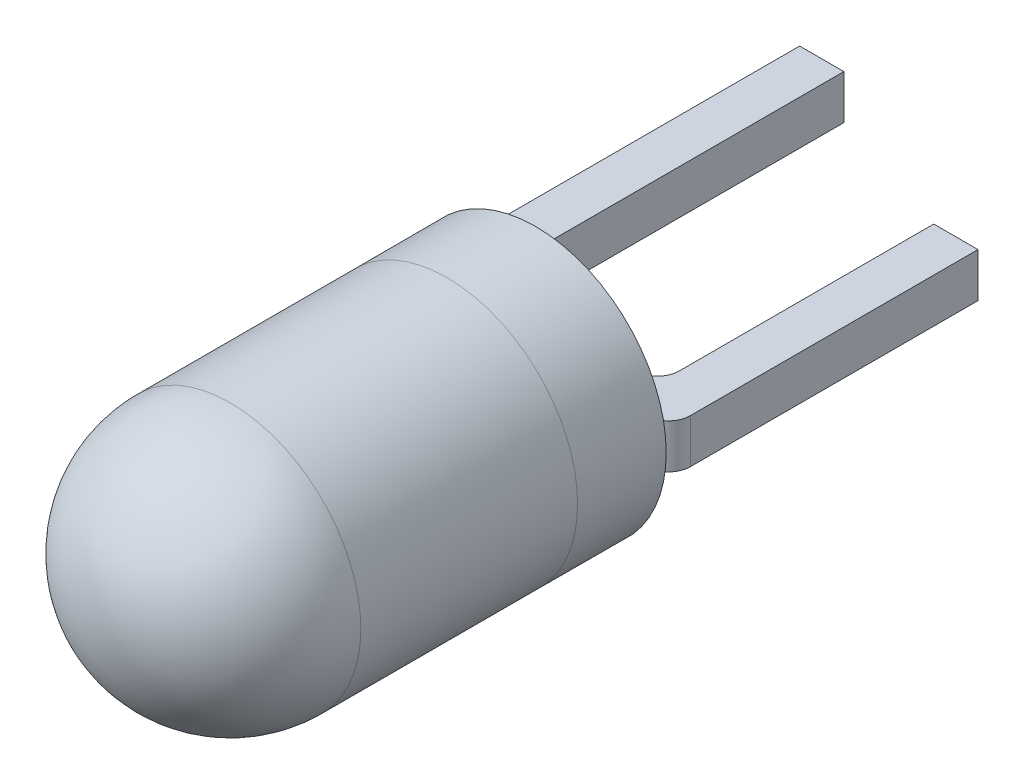
ISO-10303-21;
HEADER;
FILE_DESCRIPTION(('STEP AP214'),'2;1');
FILE_NAME('part.step','',(''),(''),'','','');
FILE_SCHEMA(('AUTOMOTIVE_DESIGN { 1 0 10303 214 1 1 1 1 }'));
ENDSEC;
DATA;
#1=APPLICATION_CONTEXT('core data for automotive mechanical design processes');
#2=APPLICATION_PROTOCOL_DEFINITION('international standard','automotive_design',2000,#1);
#3=PRODUCT_CONTEXT('',#1,'mechanical');
#4=PRODUCT('Part','Part','',(#3));
#5=PRODUCT_RELATED_PRODUCT_CATEGORY('part','',(#4));
#6=PRODUCT_DEFINITION_FORMATION('','',#4);
#7=PRODUCT_DEFINITION_CONTEXT('part definition',#1,'design');
#8=PRODUCT_DEFINITION('design','',#6,#7);
#9=PRODUCT_DEFINITION_SHAPE('','',#8);
#10=(LENGTH_UNIT() NAMED_UNIT(*) SI_UNIT(.MILLI.,.METRE.));
#11=(NAMED_UNIT(*) PLANE_ANGLE_UNIT() SI_UNIT($,.RADIAN.));
#12=(NAMED_UNIT(*) SI_UNIT($,.STERADIAN.) SOLID_ANGLE_UNIT());
#13=UNCERTAINTY_MEASURE_WITH_UNIT(LENGTH_MEASURE(1.E-05),#10,'distance_accuracy_value','');
#14=(GEOMETRIC_REPRESENTATION_CONTEXT(3) GLOBAL_UNCERTAINTY_ASSIGNED_CONTEXT((#13)) GLOBAL_UNIT_ASSIGNED_CONTEXT((#10,
#11,#12)) REPRESENTATION_CONTEXT('',''));
#15=CARTESIAN_POINT('',(0.,0.,0.));
#16=DIRECTION('',(0.,0.,1.));
#17=DIRECTION('',(1.,0.,0.));
#18=AXIS2_PLACEMENT_3D('',#15,#16,#17);
#19=CARTESIAN_POINT('',(-1.26777551269531,0.,-3.175));
#20=DIRECTION('',(0.,0.,-1.));
#21=DIRECTION('',(0.,-1.,0.));
#22=AXIS2_PLACEMENT_3D('',#19,#20,#21);
#23=PLANE('',#22);
#24=DIRECTION('',(0.,-1.,0.));
#25=VECTOR('',#24,1.);
#26=CARTESIAN_POINT('',(-1.01377551269531,0.254,-3.175));
#27=LINE('',#26,#25);
#28=CARTESIAN_POINT('',(-1.01377551269531,0.254,-3.175));
#29=VERTEX_POINT('',#28);
#30=CARTESIAN_POINT('',(-1.01377551269531,-0.254,-3.175));
#31=VERTEX_POINT('',#30);
#32=EDGE_CURVE('E304',#29,#31,#27,.T.);
#33=ORIENTED_EDGE('',*,*,#32,.T.);
#34=DIRECTION('',(-1.,0.,0.));
#35=VECTOR('',#34,1.);
#36=CARTESIAN_POINT('',(-1.01377551269531,-0.254,-3.175));
#37=LINE('',#36,#35);
#38=CARTESIAN_POINT('',(-1.52177551269531,-0.254,-3.175));
#39=VERTEX_POINT('',#38);
#40=EDGE_CURVE('E187',#31,#39,#37,.T.);
#41=ORIENTED_EDGE('',*,*,#40,.T.);
#42=DIRECTION('',(0.,1.,0.));
#43=VECTOR('',#42,1.);
#44=CARTESIAN_POINT('',(-1.52177551269531,0.254,-3.175));
#45=LINE('',#44,#43);
#46=CARTESIAN_POINT('',(-1.52177551269531,0.254,-3.175));
#47=VERTEX_POINT('',#46);
#48=EDGE_CURVE('E283',#39,#47,#45,.T.);
#49=ORIENTED_EDGE('',*,*,#48,.T.);
#50=DIRECTION('',(1.,0.,0.));
#51=VECTOR('',#50,1.);
#52=CARTESIAN_POINT('',(-1.01377551269531,0.254,-3.175));
#53=LINE('',#52,#51);
#54=EDGE_CURVE('E194',#47,#29,#53,.T.);
#55=ORIENTED_EDGE('',*,*,#54,.T.);
#56=EDGE_LOOP('',(#33,#41,#49,#55));
#57=FACE_BOUND('',#56,.T.);
#58=ADVANCED_FACE('F16',(#57),#23,.T.);
#59=CARTESIAN_POINT('',(0.764224487304689,1.53789517878773,1.381));
#60=DIRECTION('',(1.,0.,0.));
#61=DIRECTION('',(0.,-1.,0.));
#62=AXIS2_PLACEMENT_3D('',#59,#60,#61);
#63=PLANE('',#62);
#64=DIRECTION('',(0.,-1.,0.));
#65=VECTOR('',#64,1.);
#66=CARTESIAN_POINT('',(0.764224487304688,-0.254,1.));
#67=LINE('',#66,#65);
#68=CARTESIAN_POINT('',(0.764224487304688,0.254,1.));
#69=VERTEX_POINT('',#68);
#70=CARTESIAN_POINT('',(0.764224487304688,-0.254,1.));
#71=VERTEX_POINT('',#70);
#72=EDGE_CURVE('E160',#69,#71,#67,.T.);
#73=ORIENTED_EDGE('',*,*,#72,.T.);
#74=DIRECTION('',(0.,0.,1.));
#75=VECTOR('',#74,1.);
#76=CARTESIAN_POINT('',(0.764224487304688,-0.254,1.381));
#77=LINE('',#76,#75);
#78=CARTESIAN_POINT('',(0.764224487304688,-0.254,1.381));
#79=VERTEX_POINT('',#78);
#80=EDGE_CURVE('E370',#71,#79,#77,.T.);
#81=ORIENTED_EDGE('',*,*,#80,.T.);
#82=DIRECTION('',(0.,-1.,0.));
#83=VECTOR('',#82,1.);
#84=CARTESIAN_POINT('',(0.764224487304689,1.53789517878773,1.381));
#85=LINE('',#84,#83);
#86=CARTESIAN_POINT('',(0.764224487304688,0.254,1.381));
#87=VERTEX_POINT('',#86);
#88=EDGE_CURVE('E29',#87,#79,#85,.T.);
#89=ORIENTED_EDGE('',*,*,#88,.F.);
#90=DIRECTION('',(0.,0.,1.));
#91=VECTOR('',#90,1.);
#92=CARTESIAN_POINT('',(0.764224487304688,0.254,1.381));
#93=LINE('',#92,#91);
#94=EDGE_CURVE('E271',#69,#87,#93,.T.);
#95=ORIENTED_EDGE('',*,*,#94,.F.);
#96=EDGE_LOOP('',(#73,#81,#89,#95));
#97=FACE_BOUND('',#96,.T.);
#98=ADVANCED_FACE('F474',(#97),#63,.F.);
#99=CARTESIAN_POINT('',(-0.759775512695312,1.53789517878773,1.381));
#100=DIRECTION('',(-1.,0.,0.));
#101=DIRECTION('',(0.,0.,1.));
#102=AXIS2_PLACEMENT_3D('',#99,#100,#101);
#103=PLANE('',#102);
#104=DIRECTION('',(0.,-1.,0.));
#105=VECTOR('',#104,1.);
#106=CARTESIAN_POINT('',(-0.759775512695312,1.53789517878773,1.381));
#107=LINE('',#106,#105);
#108=CARTESIAN_POINT('',(-0.759775512695312,0.254,1.381));
#109=VERTEX_POINT('',#108);
#110=CARTESIAN_POINT('',(-0.759775512695312,-0.254,1.381));
#111=VERTEX_POINT('',#110);
#112=EDGE_CURVE('E158',#109,#111,#107,.T.);
#113=ORIENTED_EDGE('',*,*,#112,.T.);
#114=DIRECTION('',(0.,0.,-1.));
#115=VECTOR('',#114,1.);
#116=CARTESIAN_POINT('',(-0.759775512695312,-0.254,1.381));
#117=LINE('',#116,#115);
#118=CARTESIAN_POINT('',(-0.759775512695313,-0.254,1.));
#119=VERTEX_POINT('',#118);
#120=EDGE_CURVE('E182',#111,#119,#117,.T.);
#121=ORIENTED_EDGE('',*,*,#120,.T.);
#122=DIRECTION('',(0.,1.,0.));
#123=VECTOR('',#122,1.);
#124=CARTESIAN_POINT('',(-0.759775512695312,0.254,1.));
#125=LINE('',#124,#123);
#126=CARTESIAN_POINT('',(-0.759775512695312,0.254,1.));
#127=VERTEX_POINT('',#126);
#128=EDGE_CURVE('E327',#119,#127,#125,.T.);
#129=ORIENTED_EDGE('',*,*,#128,.T.);
#130=DIRECTION('',(0.,0.,-1.));
#131=VECTOR('',#130,1.);
#132=CARTESIAN_POINT('',(-0.759775512695312,0.254,1.381));
#133=LINE('',#132,#131);
#134=EDGE_CURVE('E165',#109,#127,#133,.T.);
#135=ORIENTED_EDGE('',*,*,#134,.F.);
#136=EDGE_LOOP('',(#113,#121,#129,#135));
#137=FACE_BOUND('',#136,.T.);
#138=ADVANCED_FACE('F438',(#137),#103,.F.);
#139=CARTESIAN_POINT('',(0.00222448730468866,0.,4.8862));
#140=DIRECTION('',(0.,0.,1.));
#141=DIRECTION('',(1.,0.,0.));
#142=AXIS2_PLACEMENT_3D('',#139,#140,#141);
#143=SPHERICAL_SURFACE('',#142,1.4986);
#144=CARTESIAN_POINT('',(0.00222448730468866,0.,4.8862));
#145=DIRECTION('',(0.,0.,-1.));
#146=DIRECTION('',(0.,1.,0.));
#147=AXIS2_PLACEMENT_3D('',#144,#145,#146);
#148=CIRCLE('',#147,1.4986);
#149=CARTESIAN_POINT('',(-1.49637551269531,0.,4.8862));
#150=VERTEX_POINT('',#149);
#151=CARTESIAN_POINT('',(0.0022244873046883,-1.4986,4.8862));
#152=VERTEX_POINT('',#151);
#153=EDGE_CURVE('E137',#150,#152,#148,.T.);
#154=ORIENTED_EDGE('',*,*,#153,.F.);
#155=CARTESIAN_POINT('',(0.00222448730468866,0.,4.8862));
#156=DIRECTION('',(0.,-1.,0.));
#157=DIRECTION('',(-1.,0.,0.));
#158=AXIS2_PLACEMENT_3D('',#155,#156,#157);
#159=CIRCLE('',#158,1.4986);
#160=CARTESIAN_POINT('',(0.00222448730468912,0.,6.3848));
#161=VERTEX_POINT('',#160);
#162=EDGE_CURVE('E11',#161,#150,#159,.T.);
#163=ORIENTED_EDGE('',*,*,#162,.F.);
#164=ORIENTED_EDGE('',*,*,#162,.T.);
#165=CARTESIAN_POINT('',(0.00222448730468866,0.,4.8862));
#166=DIRECTION('',(0.,0.,-1.));
#167=DIRECTION('',(0.,1.,0.));
#168=AXIS2_PLACEMENT_3D('',#165,#166,#167);
#169=CIRCLE('',#168,1.4986);
#170=EDGE_CURVE('E135',#152,#150,#169,.T.);
#171=ORIENTED_EDGE('',*,*,#170,.F.);
#172=EDGE_LOOP('',(#154,#163,#164,#171));
#173=FACE_BOUND('',#172,.T.);
#174=ADVANCED_FACE('F133',(#173),#143,.T.);
#175=CARTESIAN_POINT('',(0.00222448730468783,0.,1.381));
#176=DIRECTION('',(0.,0.,1.));
#177=DIRECTION('',(0.,-1.,0.));
#178=AXIS2_PLACEMENT_3D('',#175,#176,#177);
#179=PLANE('',#178);
#180=DIRECTION('',(-1.,0.,0.));
#181=VECTOR('',#180,1.);
#182=CARTESIAN_POINT('',(-1.52177551269531,0.254,1.381));
#183=LINE('',#182,#181);
#184=CARTESIAN_POINT('',(1.27222448730469,0.254,1.381));
#185=VERTEX_POINT('',#184);
#186=EDGE_CURVE('E266',#185,#87,#183,.T.);
#187=ORIENTED_EDGE('',*,*,#186,.T.);
#188=ORIENTED_EDGE('',*,*,#88,.T.);
#189=DIRECTION('',(1.,0.,0.));
#190=VECTOR('',#189,1.);
#191=CARTESIAN_POINT('',(-1.52177551269531,-0.254,1.381));
#192=LINE('',#191,#190);
#193=CARTESIAN_POINT('',(1.27222448730469,-0.254,1.381));
#194=VERTEX_POINT('',#193);
#195=EDGE_CURVE('E286',#79,#194,#192,.T.);
#196=ORIENTED_EDGE('',*,*,#195,.T.);
#197=DIRECTION('',(0.,1.,0.));
#198=VECTOR('',#197,1.);
#199=CARTESIAN_POINT('',(1.27222448730469,0.254,1.381));
#200=LINE('',#199,#198);
#201=EDGE_CURVE('E320',#194,#185,#200,.T.);
#202=ORIENTED_EDGE('',*,*,#201,.T.);
#203=EDGE_LOOP('',(#187,#188,#196,#202));
#204=FACE_BOUND('',#203,.T.);
#205=ORIENTED_EDGE('',*,*,#112,.F.);
#206=DIRECTION('',(-1.,0.,0.));
#207=VECTOR('',#206,1.);
#208=CARTESIAN_POINT('',(-1.52177551269531,0.254,1.381));
#209=LINE('',#208,#207);
#210=CARTESIAN_POINT('',(-1.26777551269531,0.254,1.381));
#211=VERTEX_POINT('',#210);
#212=EDGE_CURVE('E161',#109,#211,#209,.T.);
#213=ORIENTED_EDGE('',*,*,#212,.T.);
#214=DIRECTION('',(0.,-1.,0.));
#215=VECTOR('',#214,1.);
#216=CARTESIAN_POINT('',(-1.26777551269531,-0.254,1.381));
#217=LINE('',#216,#215);
#218=CARTESIAN_POINT('',(-1.26777551269531,-0.254,1.381));
#219=VERTEX_POINT('',#218);
#220=EDGE_CURVE('E311',#211,#219,#217,.T.);
#221=ORIENTED_EDGE('',*,*,#220,.T.);
#222=DIRECTION('',(1.,0.,0.));
#223=VECTOR('',#222,1.);
#224=CARTESIAN_POINT('',(-1.52177551269531,-0.254,1.381));
#225=LINE('',#224,#223);
#226=EDGE_CURVE('E252',#219,#111,#225,.T.);
#227=ORIENTED_EDGE('',*,*,#226,.T.);
#228=EDGE_LOOP('',(#205,#213,#221,#227));
#229=FACE_BOUND('',#228,.T.);
#230=CARTESIAN_POINT('',(0.00222448730468783,0.,1.381));
#231=DIRECTION('',(0.,0.,1.));
#232=DIRECTION('',(0.,-1.,0.));
#233=AXIS2_PLACEMENT_3D('',#230,#231,#232);
#234=CIRCLE('',#233,1.5);
#235=CARTESIAN_POINT('',(0.00222448730468731,-1.5,1.381));
#236=VERTEX_POINT('',#235);
#237=EDGE_CURVE('E167',#236,#236,#234,.T.);
#238=ORIENTED_EDGE('',*,*,#237,.F.);
#239=EDGE_LOOP('',(#238));
#240=FACE_BOUND('',#239,.T.);
#241=ADVANCED_FACE('F442',(#204,#229,#240),#179,.F.);
#242=CARTESIAN_POINT('',(0.764224487304688,-0.254,0.746));
#243=DIRECTION('',(0.,-1.,0.));
#244=DIRECTION('',(1.,0.,0.));
#245=AXIS2_PLACEMENT_3D('',#242,#243,#244);
#246=CYLINDRICAL_SURFACE('',#245,0.254);
#247=CARTESIAN_POINT('',(0.764224487304688,-0.254,0.746));
#248=DIRECTION('',(0.,1.,0.));
#249=DIRECTION('',(-1.,0.,0.));
#250=AXIS2_PLACEMENT_3D('',#247,#248,#249);
#251=CIRCLE('',#250,0.254);
#252=CARTESIAN_POINT('',(1.01822448730469,-0.254,0.746));
#253=VERTEX_POINT('',#252);
#254=EDGE_CURVE('E177',#71,#253,#251,.T.);
#255=ORIENTED_EDGE('',*,*,#254,.F.);
#256=ORIENTED_EDGE('',*,*,#72,.F.);
#257=CARTESIAN_POINT('',(0.764224487304688,0.254,0.746));
#258=DIRECTION('',(0.,-1.,0.));
#259=DIRECTION('',(1.,0.,0.));
#260=AXIS2_PLACEMENT_3D('',#257,#258,#259);
#261=CIRCLE('',#260,0.254);
#262=CARTESIAN_POINT('',(1.01822448730469,0.254,0.746));
#263=VERTEX_POINT('',#262);
#264=EDGE_CURVE('E296',#263,#69,#261,.T.);
#265=ORIENTED_EDGE('',*,*,#264,.F.);
#266=DIRECTION('',(0.,1.,0.));
#267=VECTOR('',#266,1.);
#268=CARTESIAN_POINT('',(1.01822448730469,0.254,0.746));
#269=LINE('',#268,#267);
#270=EDGE_CURVE('E156',#253,#263,#269,.T.);
#271=ORIENTED_EDGE('',*,*,#270,.F.);
#272=EDGE_LOOP('',(#255,#256,#265,#271));
#273=FACE_BOUND('',#272,.T.);
#274=ADVANCED_FACE('F479',(#273),#246,.F.);
#275=CARTESIAN_POINT('',(-0.759775512695313,-0.254,0.746));
#276=DIRECTION('',(0.,1.,0.));
#277=DIRECTION('',(-1.,0.,0.));
#278=AXIS2_PLACEMENT_3D('',#275,#276,#277);
#279=CYLINDRICAL_SURFACE('',#278,0.254);
#280=CARTESIAN_POINT('',(-0.759775512695312,0.254,0.746));
#281=DIRECTION('',(0.,-1.,0.));
#282=DIRECTION('',(1.,0.,0.));
#283=AXIS2_PLACEMENT_3D('',#280,#281,#282);
#284=CIRCLE('',#283,0.254);
#285=CARTESIAN_POINT('',(-1.01377551269531,0.254,0.746));
#286=VERTEX_POINT('',#285);
#287=EDGE_CURVE('E273',#127,#286,#284,.T.);
#288=ORIENTED_EDGE('',*,*,#287,.F.);
#289=ORIENTED_EDGE('',*,*,#128,.F.);
#290=CARTESIAN_POINT('',(-0.759775512695313,-0.254,0.746));
#291=DIRECTION('',(0.,1.,0.));
#292=DIRECTION('',(-1.,0.,0.));
#293=AXIS2_PLACEMENT_3D('',#290,#291,#292);
#294=CIRCLE('',#293,0.254);
#295=CARTESIAN_POINT('',(-1.01377551269531,-0.254,0.746));
#296=VERTEX_POINT('',#295);
#297=EDGE_CURVE('E178',#296,#119,#294,.T.);
#298=ORIENTED_EDGE('',*,*,#297,.F.);
#299=DIRECTION('',(0.,-1.,0.));
#300=VECTOR('',#299,1.);
#301=CARTESIAN_POINT('',(-1.01377551269531,-0.254,0.746));
#302=LINE('',#301,#300);
#303=EDGE_CURVE('E302',#286,#296,#302,.T.);
#304=ORIENTED_EDGE('',*,*,#303,.F.);
#305=EDGE_LOOP('',(#288,#289,#298,#304));
#306=FACE_BOUND('',#305,.T.);
#307=ADVANCED_FACE('F432',(#306),#279,.F.);
#308=CARTESIAN_POINT('',(1.27222448730469,-0.254,1.127));
#309=DIRECTION('',(0.,-1.,0.));
#310=DIRECTION('',(1.,0.,0.));
#311=AXIS2_PLACEMENT_3D('',#308,#309,#310);
#312=CYLINDRICAL_SURFACE('',#311,0.254);
#313=CARTESIAN_POINT('',(1.27222448730469,-0.254,1.127));
#314=DIRECTION('',(0.,-1.,0.));
#315=DIRECTION('',(-1.,0.,0.));
#316=AXIS2_PLACEMENT_3D('',#313,#314,#315);
#317=CIRCLE('',#316,0.254);
#318=CARTESIAN_POINT('',(1.52622448730469,-0.254,1.127));
#319=VERTEX_POINT('',#318);
#320=EDGE_CURVE('E200',#319,#194,#317,.T.);
#321=ORIENTED_EDGE('',*,*,#320,.F.);
#322=DIRECTION('',(0.,-1.,0.));
#323=VECTOR('',#322,1.);
#324=CARTESIAN_POINT('',(1.52622448730469,-0.254,1.127));
#325=LINE('',#324,#323);
#326=CARTESIAN_POINT('',(1.52622448730469,0.254,1.127));
#327=VERTEX_POINT('',#326);
#328=EDGE_CURVE('E199',#327,#319,#325,.T.);
#329=ORIENTED_EDGE('',*,*,#328,.F.);
#330=CARTESIAN_POINT('',(1.27222448730469,0.254,1.127));
#331=DIRECTION('',(0.,1.,0.));
#332=DIRECTION('',(1.,0.,0.));
#333=AXIS2_PLACEMENT_3D('',#330,#331,#332);
#334=CIRCLE('',#333,0.254);
#335=EDGE_CURVE('E270',#185,#327,#334,.T.);
#336=ORIENTED_EDGE('',*,*,#335,.F.);
#337=ORIENTED_EDGE('',*,*,#201,.F.);
#338=EDGE_LOOP('',(#321,#329,#336,#337));
#339=FACE_BOUND('',#338,.T.);
#340=ADVANCED_FACE('F589',(#339),#312,.T.);
#341=CARTESIAN_POINT('',(-1.26777551269531,-0.254,1.127));
#342=DIRECTION('',(0.,1.,0.));
#343=DIRECTION('',(-1.,0.,0.));
#344=AXIS2_PLACEMENT_3D('',#341,#342,#343);
#345=CYLINDRICAL_SURFACE('',#344,0.254);
#346=CARTESIAN_POINT('',(-1.26777551269531,0.254,1.127));
#347=DIRECTION('',(0.,1.,0.));
#348=DIRECTION('',(1.,0.,0.));
#349=AXIS2_PLACEMENT_3D('',#346,#347,#348);
#350=CIRCLE('',#349,0.254);
#351=CARTESIAN_POINT('',(-1.52177551269531,0.254,1.127));
#352=VERTEX_POINT('',#351);
#353=EDGE_CURVE('E193',#352,#211,#350,.T.);
#354=ORIENTED_EDGE('',*,*,#353,.F.);
#355=DIRECTION('',(0.,1.,0.));
#356=VECTOR('',#355,1.);
#357=CARTESIAN_POINT('',(-1.52177551269531,0.254,1.127));
#358=LINE('',#357,#356);
#359=CARTESIAN_POINT('',(-1.52177551269531,-0.254,1.127));
#360=VERTEX_POINT('',#359);
#361=EDGE_CURVE('E287',#360,#352,#358,.T.);
#362=ORIENTED_EDGE('',*,*,#361,.F.);
#363=CARTESIAN_POINT('',(-1.26777551269531,-0.254,1.127));
#364=DIRECTION('',(0.,-1.,0.));
#365=DIRECTION('',(-1.,0.,0.));
#366=AXIS2_PLACEMENT_3D('',#363,#364,#365);
#367=CIRCLE('',#366,0.254);
#368=EDGE_CURVE('E188',#219,#360,#367,.T.);
#369=ORIENTED_EDGE('',*,*,#368,.F.);
#370=ORIENTED_EDGE('',*,*,#220,.F.);
#371=EDGE_LOOP('',(#354,#362,#369,#370));
#372=FACE_BOUND('',#371,.T.);
#373=ADVANCED_FACE('F416',(#372),#345,.T.);
#374=CARTESIAN_POINT('',(1.52622448730469,0.254,-2.175));
#375=DIRECTION('',(0.,0.,1.));
#376=DIRECTION('',(0.,-1.,0.));
#377=AXIS2_PLACEMENT_3D('',#374,#375,#376);
#378=PLANE('',#377);
#379=DIRECTION('',(0.,-1.,0.));
#380=VECTOR('',#379,1.);
#381=CARTESIAN_POINT('',(1.52622448730469,-0.254,-2.175));
#382=LINE('',#381,#380);
#383=CARTESIAN_POINT('',(1.52622448730469,0.254,-2.175));
#384=VERTEX_POINT('',#383);
#385=CARTESIAN_POINT('',(1.52622448730469,-0.254,-2.175));
#386=VERTEX_POINT('',#385);
#387=EDGE_CURVE('E341',#384,#386,#382,.T.);
#388=ORIENTED_EDGE('',*,*,#387,.T.);
#389=DIRECTION('',(-1.,0.,0.));
#390=VECTOR('',#389,1.);
#391=CARTESIAN_POINT('',(1.52622448730469,-0.254,-2.175));
#392=LINE('',#391,#390);
#393=CARTESIAN_POINT('',(1.01822448730469,-0.254,-2.175));
#394=VERTEX_POINT('',#393);
#395=EDGE_CURVE('E176',#386,#394,#392,.T.);
#396=ORIENTED_EDGE('',*,*,#395,.T.);
#397=DIRECTION('',(0.,1.,0.));
#398=VECTOR('',#397,1.);
#399=CARTESIAN_POINT('',(1.01822448730469,-0.254,-2.175));
#400=LINE('',#399,#398);
#401=CARTESIAN_POINT('',(1.01822448730469,0.254,-2.175));
#402=VERTEX_POINT('',#401);
#403=EDGE_CURVE('E307',#394,#402,#400,.T.);
#404=ORIENTED_EDGE('',*,*,#403,.T.);
#405=DIRECTION('',(1.,0.,0.));
#406=VECTOR('',#405,1.);
#407=CARTESIAN_POINT('',(1.52622448730469,0.254,-2.175));
#408=LINE('',#407,#406);
#409=EDGE_CURVE('E291',#402,#384,#408,.T.);
#410=ORIENTED_EDGE('',*,*,#409,.T.);
#411=EDGE_LOOP('',(#388,#396,#404,#410));
#412=FACE_BOUND('',#411,.T.);
#413=ADVANCED_FACE('F229',(#412),#378,.F.);
#414=CARTESIAN_POINT('',(1.01822448730469,-0.254,-2.175));
#415=DIRECTION('',(1.,0.,0.));
#416=DIRECTION('',(0.,-1.,0.));
#417=AXIS2_PLACEMENT_3D('',#414,#415,#416);
#418=PLANE('',#417);
#419=DIRECTION('',(0.,0.,1.));
#420=VECTOR('',#419,1.);
#421=CARTESIAN_POINT('',(1.01822448730469,-0.254,-2.175));
#422=LINE('',#421,#420);
#423=EDGE_CURVE('E172',#394,#253,#422,.T.);
#424=ORIENTED_EDGE('',*,*,#423,.T.);
#425=ORIENTED_EDGE('',*,*,#270,.T.);
#426=DIRECTION('',(0.,0.,1.));
#427=VECTOR('',#426,1.);
#428=CARTESIAN_POINT('',(1.01822448730469,0.254,-2.175));
#429=LINE('',#428,#427);
#430=EDGE_CURVE('E298',#402,#263,#429,.T.);
#431=ORIENTED_EDGE('',*,*,#430,.F.);
#432=ORIENTED_EDGE('',*,*,#403,.F.);
#433=EDGE_LOOP('',(#424,#425,#431,#432));
#434=FACE_BOUND('',#433,.T.);
#435=ADVANCED_FACE('F359',(#434),#418,.F.);
#436=CARTESIAN_POINT('',(-1.01377551269531,-0.254,-2.175));
#437=DIRECTION('',(-1.,0.,0.));
#438=DIRECTION('',(0.,0.,1.));
#439=AXIS2_PLACEMENT_3D('',#436,#437,#438);
#440=PLANE('',#439);
#441=DIRECTION('',(0.,0.,1.));
#442=VECTOR('',#441,1.);
#443=CARTESIAN_POINT('',(-1.01377551269531,0.254,-2.175));
#444=LINE('',#443,#442);
#445=EDGE_CURVE('E277',#29,#286,#444,.T.);
#446=ORIENTED_EDGE('',*,*,#445,.T.);
#447=ORIENTED_EDGE('',*,*,#303,.T.);
#448=DIRECTION('',(0.,0.,1.));
#449=VECTOR('',#448,1.);
#450=CARTESIAN_POINT('',(-1.01377551269531,-0.254,-2.175));
#451=LINE('',#450,#449);
#452=EDGE_CURVE('E166',#31,#296,#451,.T.);
#453=ORIENTED_EDGE('',*,*,#452,.F.);
#454=ORIENTED_EDGE('',*,*,#32,.F.);
#455=EDGE_LOOP('',(#446,#447,#453,#454));
#456=FACE_BOUND('',#455,.T.);
#457=ADVANCED_FACE('F666',(#456),#440,.F.);
#458=CARTESIAN_POINT('',(-1.52177551269531,0.254,1.381));
#459=DIRECTION('',(0.,-1.,0.));
#460=DIRECTION('',(-1.,0.,0.));
#461=AXIS2_PLACEMENT_3D('',#458,#459,#460);
#462=PLANE('',#461);
#463=ORIENTED_EDGE('',*,*,#264,.T.);
#464=ORIENTED_EDGE('',*,*,#94,.T.);
#465=ORIENTED_EDGE('',*,*,#186,.F.);
#466=ORIENTED_EDGE('',*,*,#335,.T.);
#467=DIRECTION('',(0.,0.,-1.));
#468=VECTOR('',#467,1.);
#469=CARTESIAN_POINT('',(1.52622448730469,0.254,1.381));
#470=LINE('',#469,#468);
#471=EDGE_CURVE('E195',#327,#384,#470,.T.);
#472=ORIENTED_EDGE('',*,*,#471,.T.);
#473=ORIENTED_EDGE('',*,*,#409,.F.);
#474=ORIENTED_EDGE('',*,*,#430,.T.);
#475=EDGE_LOOP('',(#463,#464,#465,#466,#472,#473,#474));
#476=FACE_BOUND('',#475,.T.);
#477=ADVANCED_FACE('F363',(#476),#462,.F.);
#478=CARTESIAN_POINT('',(1.52622448730469,0.254,1.381));
#479=DIRECTION('',(-1.,0.,0.));
#480=DIRECTION('',(0.,0.,1.));
#481=AXIS2_PLACEMENT_3D('',#478,#479,#480);
#482=PLANE('',#481);
#483=ORIENTED_EDGE('',*,*,#471,.F.);
#484=ORIENTED_EDGE('',*,*,#328,.T.);
#485=DIRECTION('',(0.,0.,-1.));
#486=VECTOR('',#485,1.);
#487=CARTESIAN_POINT('',(1.52622448730469,-0.254,1.381));
#488=LINE('',#487,#486);
#489=EDGE_CURVE('E257',#319,#386,#488,.T.);
#490=ORIENTED_EDGE('',*,*,#489,.T.);
#491=ORIENTED_EDGE('',*,*,#387,.F.);
#492=EDGE_LOOP('',(#483,#484,#490,#491));
#493=FACE_BOUND('',#492,.T.);
#494=ADVANCED_FACE('F614',(#493),#482,.F.);
#495=CARTESIAN_POINT('',(-1.52177551269531,-0.254,1.381));
#496=DIRECTION('',(0.,1.,0.));
#497=DIRECTION('',(0.,0.,-1.));
#498=AXIS2_PLACEMENT_3D('',#495,#496,#497);
#499=PLANE('',#498);
#500=ORIENTED_EDGE('',*,*,#195,.F.);
#501=ORIENTED_EDGE('',*,*,#80,.F.);
#502=ORIENTED_EDGE('',*,*,#254,.T.);
#503=ORIENTED_EDGE('',*,*,#423,.F.);
#504=ORIENTED_EDGE('',*,*,#395,.F.);
#505=ORIENTED_EDGE('',*,*,#489,.F.);
#506=ORIENTED_EDGE('',*,*,#320,.T.);
#507=EDGE_LOOP('',(#500,#501,#502,#503,#504,#505,#506));
#508=FACE_BOUND('',#507,.T.);
#509=ADVANCED_FACE('F356',(#508),#499,.F.);
#510=CARTESIAN_POINT('',(-1.52177551269531,0.254,1.381));
#511=DIRECTION('',(1.,0.,0.));
#512=DIRECTION('',(0.,0.,-1.));
#513=AXIS2_PLACEMENT_3D('',#510,#511,#512);
#514=PLANE('',#513);
#515=DIRECTION('',(0.,0.,-1.));
#516=VECTOR('',#515,1.);
#517=CARTESIAN_POINT('',(-1.52177551269531,-0.254,1.381));
#518=LINE('',#517,#516);
#519=EDGE_CURVE('E183',#360,#39,#518,.T.);
#520=ORIENTED_EDGE('',*,*,#519,.F.);
#521=ORIENTED_EDGE('',*,*,#361,.T.);
#522=DIRECTION('',(0.,0.,-1.));
#523=VECTOR('',#522,1.);
#524=CARTESIAN_POINT('',(-1.52177551269531,0.254,1.381));
#525=LINE('',#524,#523);
#526=EDGE_CURVE('E189',#352,#47,#525,.T.);
#527=ORIENTED_EDGE('',*,*,#526,.T.);
#528=ORIENTED_EDGE('',*,*,#48,.F.);
#529=EDGE_LOOP('',(#520,#521,#527,#528));
#530=FACE_BOUND('',#529,.T.);
#531=ADVANCED_FACE('F420',(#530),#514,.F.);
#532=CARTESIAN_POINT('',(-1.52177551269531,0.254,1.381));
#533=DIRECTION('',(0.,-1.,0.));
#534=DIRECTION('',(-1.,0.,0.));
#535=AXIS2_PLACEMENT_3D('',#532,#533,#534);
#536=PLANE('',#535);
#537=ORIENTED_EDGE('',*,*,#212,.F.);
#538=ORIENTED_EDGE('',*,*,#134,.T.);
#539=ORIENTED_EDGE('',*,*,#287,.T.);
#540=ORIENTED_EDGE('',*,*,#445,.F.);
#541=ORIENTED_EDGE('',*,*,#54,.F.);
#542=ORIENTED_EDGE('',*,*,#526,.F.);
#543=ORIENTED_EDGE('',*,*,#353,.T.);
#544=EDGE_LOOP('',(#537,#538,#539,#540,#541,#542,#543));
#545=FACE_BOUND('',#544,.T.);
#546=ADVANCED_FACE('F231',(#545),#536,.F.);
#547=CARTESIAN_POINT('',(-1.52177551269531,-0.254,1.381));
#548=DIRECTION('',(0.,1.,0.));
#549=DIRECTION('',(0.,0.,-1.));
#550=AXIS2_PLACEMENT_3D('',#547,#548,#549);
#551=PLANE('',#550);
#552=ORIENTED_EDGE('',*,*,#297,.T.);
#553=ORIENTED_EDGE('',*,*,#120,.F.);
#554=ORIENTED_EDGE('',*,*,#226,.F.);
#555=ORIENTED_EDGE('',*,*,#368,.T.);
#556=ORIENTED_EDGE('',*,*,#519,.T.);
#557=ORIENTED_EDGE('',*,*,#40,.F.);
#558=ORIENTED_EDGE('',*,*,#452,.T.);
#559=EDGE_LOOP('',(#552,#553,#554,#555,#556,#557,#558));
#560=FACE_BOUND('',#559,.T.);
#561=ADVANCED_FACE('F18',(#560),#551,.F.);
#562=CARTESIAN_POINT('',(0.00222448730468811,0.,2.397));
#563=DIRECTION('',(0.,0.,-1.));
#564=DIRECTION('',(0.,1.,0.));
#565=AXIS2_PLACEMENT_3D('',#562,#563,#564);
#566=CYLINDRICAL_SURFACE('',#565,1.5);
#567=ORIENTED_EDGE('',*,*,#237,.T.);
#568=DIRECTION('',(0.,0.,1.));
#569=VECTOR('',#568,1.);
#570=CARTESIAN_POINT('',(0.00222448730468755,-1.5,2.397));
#571=LINE('',#570,#569);
#572=CARTESIAN_POINT('',(0.00222448730468811,-1.4993,2.397));
#573=VERTEX_POINT('',#572);
#574=EDGE_CURVE('E171',#236,#573,#571,.T.);
#575=ORIENTED_EDGE('',*,*,#574,.T.);
#576=CARTESIAN_POINT('',(0.00222448730468824,0.,2.397));
#577=DIRECTION('',(0.,0.,1.));
#578=DIRECTION('',(0.,1.,0.));
#579=AXIS2_PLACEMENT_3D('',#576,#577,#578);
#580=CIRCLE('',#579,1.4986);
#581=CARTESIAN_POINT('',(0.00222448730468727,1.4993,2.397));
#582=VERTEX_POINT('',#581);
#583=EDGE_CURVE('E152',#582,#573,#580,.T.);
#584=ORIENTED_EDGE('',*,*,#583,.F.);
#585=CARTESIAN_POINT('',(0.00222448730468824,0.,2.397));
#586=DIRECTION('',(0.,0.,1.));
#587=DIRECTION('',(0.,-1.,0.));
#588=AXIS2_PLACEMENT_3D('',#585,#586,#587);
#589=CIRCLE('',#588,1.4986);
#590=EDGE_CURVE('E141',#573,#582,#589,.T.);
#591=ORIENTED_EDGE('',*,*,#590,.F.);
#592=ORIENTED_EDGE('',*,*,#574,.F.);
#593=EDGE_LOOP('',(#567,#575,#584,#591,#592));
#594=FACE_BOUND('',#593,.T.);
#595=ADVANCED_FACE('F228',(#594),#566,.T.);
#596=CARTESIAN_POINT('',(0.00222448730468922,0.,6.3848));
#597=DIRECTION('',(0.,0.,-1.));
#598=DIRECTION('',(0.,1.,0.));
#599=AXIS2_PLACEMENT_3D('',#596,#597,#598);
#600=CYLINDRICAL_SURFACE('',#599,1.4986);
#601=ORIENTED_EDGE('',*,*,#583,.T.);
#602=DIRECTION('',(0.,0.,1.));
#603=VECTOR('',#602,1.);
#604=CARTESIAN_POINT('',(0.00222448730468867,-1.4986,6.3848));
#605=LINE('',#604,#603);
#606=EDGE_CURVE('E145',#573,#152,#605,.T.);
#607=ORIENTED_EDGE('',*,*,#606,.T.);
#608=ORIENTED_EDGE('',*,*,#170,.T.);
#609=ORIENTED_EDGE('',*,*,#153,.T.);
#610=ORIENTED_EDGE('',*,*,#606,.F.);
#611=ORIENTED_EDGE('',*,*,#590,.T.);
#612=EDGE_LOOP('',(#601,#607,#608,#609,#610,#611));
#613=FACE_BOUND('',#612,.T.);
#614=ADVANCED_FACE('F144',(#613),#600,.T.);
#615=CLOSED_SHELL('',(#58,#98,#138,#174,#241,#274,#307,#340,#373,#413,#435,#457,#477,#494,#509,
#531,#546,#561,#595,#614));
#616=MANIFOLD_SOLID_BREP('B1',#615);
#617=ADVANCED_BREP_SHAPE_REPRESENTATION('',(#18,#616),#14);
#618=SHAPE_DEFINITION_REPRESENTATION(#9,#617);
ENDSEC;
END-ISO-10303-21;
